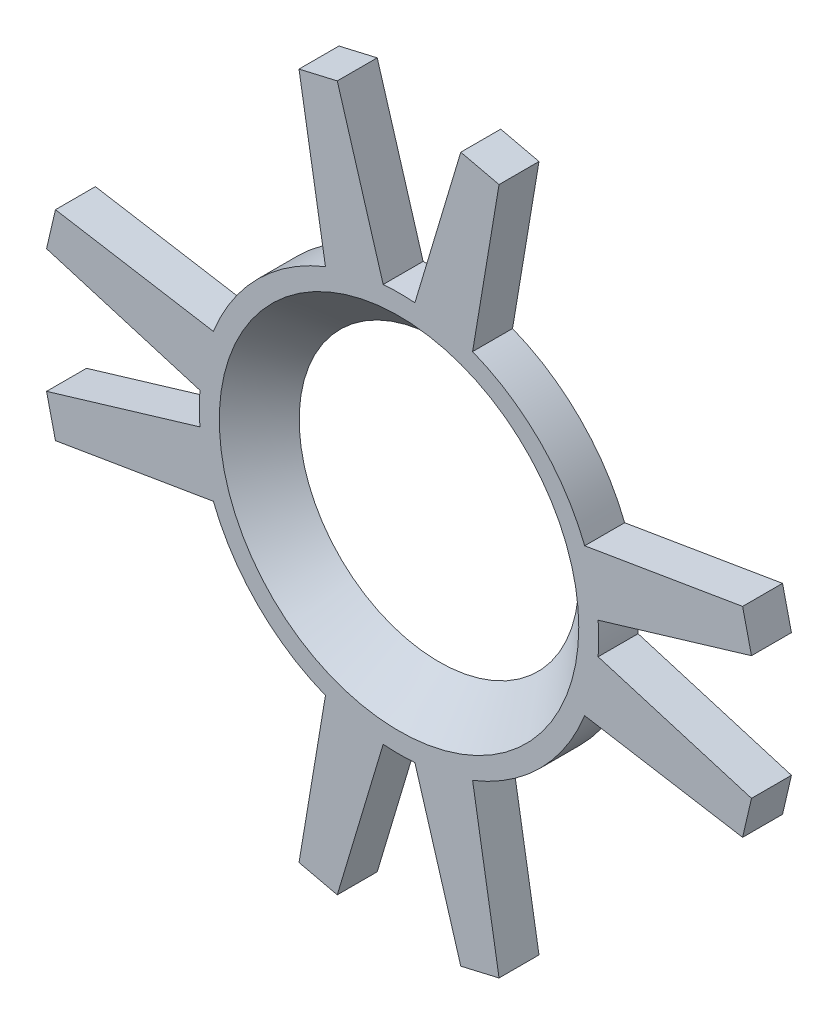
ISO-10303-21;
HEADER;
FILE_DESCRIPTION(('STEP AP214'),'2;1');
FILE_NAME('part.step','',(''),(''),'','','');
FILE_SCHEMA(('AUTOMOTIVE_DESIGN { 1 0 10303 214 1 1 1 1 }'));
ENDSEC;
DATA;
#1=APPLICATION_CONTEXT('core data for automotive mechanical design processes');
#2=APPLICATION_PROTOCOL_DEFINITION('international standard','automotive_design',2000,#1);
#3=PRODUCT_CONTEXT('',#1,'mechanical');
#4=PRODUCT('Part','Part','',(#3));
#5=PRODUCT_RELATED_PRODUCT_CATEGORY('part','',(#4));
#6=PRODUCT_DEFINITION_FORMATION('','',#4);
#7=PRODUCT_DEFINITION_CONTEXT('part definition',#1,'design');
#8=PRODUCT_DEFINITION('design','',#6,#7);
#9=PRODUCT_DEFINITION_SHAPE('','',#8);
#10=(LENGTH_UNIT() NAMED_UNIT(*) SI_UNIT(.MILLI.,.METRE.));
#11=(NAMED_UNIT(*) PLANE_ANGLE_UNIT() SI_UNIT($,.RADIAN.));
#12=(NAMED_UNIT(*) SI_UNIT($,.STERADIAN.) SOLID_ANGLE_UNIT());
#13=UNCERTAINTY_MEASURE_WITH_UNIT(LENGTH_MEASURE(1.E-05),#10,'distance_accuracy_value','');
#14=(GEOMETRIC_REPRESENTATION_CONTEXT(3) GLOBAL_UNCERTAINTY_ASSIGNED_CONTEXT((#13)) GLOBAL_UNIT_ASSIGNED_CONTEXT((#10,
#11,#12)) REPRESENTATION_CONTEXT('',''));
#15=CARTESIAN_POINT('',(0.,0.,0.));
#16=DIRECTION('',(0.,0.,1.));
#17=DIRECTION('',(1.,0.,0.));
#18=AXIS2_PLACEMENT_3D('',#15,#16,#17);
#19=CARTESIAN_POINT('',(0.,0.,2.));
#20=DIRECTION('',(0.,0.,1.));
#21=DIRECTION('',(1.,0.,0.));
#22=AXIS2_PLACEMENT_3D('',#19,#20,#21);
#23=PLANE('',#22);
#24=CARTESIAN_POINT('',(0.,0.,2.));
#25=DIRECTION('',(0.,0.,1.));
#26=DIRECTION('',(1.,0.,0.));
#27=AXIS2_PLACEMENT_3D('',#24,#25,#26);
#28=CIRCLE('',#27,9.00000000000002);
#29=CARTESIAN_POINT('',(9.00000000000002,0.,2.));
#30=VERTEX_POINT('',#29);
#31=EDGE_CURVE('E12',#30,#30,#28,.F.);
#32=ORIENTED_EDGE('',*,*,#31,.T.);
#33=EDGE_LOOP('',(#32));
#34=FACE_BOUND('',#33,.T.);
#35=DIRECTION('',(0.974038420725054,-0.226382762045708,0.));
#36=VECTOR('',#35,1.);
#37=CARTESIAN_POINT('',(-4.04984352686298,-17.4249273992547,2.));
#38=LINE('',#37,#36);
#39=CARTESIAN_POINT('',(-5.00771732151806,-17.202301565703,2.));
#40=VERTEX_POINT('',#39);
#41=CARTESIAN_POINT('',(-3.09196973220788,-17.6475532328063,2.));
#42=VERTEX_POINT('',#41);
#43=EDGE_CURVE('E484',#40,#42,#38,.T.);
#44=ORIENTED_EDGE('',*,*,#43,.T.);
#45=DIRECTION('',(0.286700746717936,0.95802018863455,0.));
#46=VECTOR('',#45,1.);
#47=CARTESIAN_POINT('',(2.00934892200833,-0.601325361606156,2.));
#48=LINE('',#47,#46);
#49=CARTESIAN_POINT('',(-0.793888425479593,-9.96843724802872,2.));
#50=VERTEX_POINT('',#49);
#51=EDGE_CURVE('E481',#42,#50,#48,.T.);
#52=ORIENTED_EDGE('',*,*,#51,.T.);
#53=CARTESIAN_POINT('',(0.,0.,2.));
#54=DIRECTION('',(0.,0.,1.));
#55=DIRECTION('',(1.,0.,0.));
#56=AXIS2_PLACEMENT_3D('',#53,#54,#55);
#57=CIRCLE('',#56,10.);
#58=CARTESIAN_POINT('',(0.793888425479691,-9.96843724802872,2.));
#59=VERTEX_POINT('',#58);
#60=EDGE_CURVE('E408',#50,#59,#57,.T.);
#61=ORIENTED_EDGE('',*,*,#60,.T.);
#62=DIRECTION('',(-0.286700746717936,0.95802018863455,0.));
#63=VECTOR('',#62,1.);
#64=CARTESIAN_POINT('',(-2.00934892200825,-0.601325361606131,2.));
#65=LINE('',#64,#63);
#66=CARTESIAN_POINT('',(3.09196973220798,-17.6475532328063,2.));
#67=VERTEX_POINT('',#66);
#68=EDGE_CURVE('E480',#67,#59,#65,.T.);
#69=ORIENTED_EDGE('',*,*,#68,.F.);
#70=DIRECTION('',(-0.974038420725054,-0.226382762045708,0.));
#71=VECTOR('',#70,1.);
#72=CARTESIAN_POINT('',(4.04984352686299,-17.4249273992547,2.));
#73=LINE('',#72,#71);
#74=CARTESIAN_POINT('',(5.00771732151816,-17.202301565703,2.));
#75=VERTEX_POINT('',#74);
#76=EDGE_CURVE('E507',#75,#67,#73,.T.);
#77=ORIENTED_EDGE('',*,*,#76,.F.);
#78=DIRECTION('',(-0.165183052049659,0.98626292605753,0.));
#79=VECTOR('',#78,1.);
#80=CARTESIAN_POINT('',(2.06858516219274,0.346454481343553,2.));
#81=LINE('',#80,#79);
#82=CARTESIAN_POINT('',(3.6836744355151,-9.29680281887972,2.));
#83=VERTEX_POINT('',#82);
#84=EDGE_CURVE('E504',#75,#83,#81,.T.);
#85=ORIENTED_EDGE('',*,*,#84,.T.);
#86=CARTESIAN_POINT('',(9.29680281887979,-3.68367443551499,2.));
#87=VERTEX_POINT('',#86);
#88=EDGE_CURVE('E400',#83,#87,#57,.T.);
#89=ORIENTED_EDGE('',*,*,#88,.T.);
#90=DIRECTION('',(-0.98626292605753,0.165183052049659,0.));
#91=VECTOR('',#90,1.);
#92=CARTESIAN_POINT('',(-0.346454481343533,-2.06858516219263,2.));
#93=LINE('',#92,#91);
#94=CARTESIAN_POINT('',(17.2023015657031,-5.00771732151804,2.));
#95=VERTEX_POINT('',#94);
#96=EDGE_CURVE('E440',#95,#87,#93,.T.);
#97=ORIENTED_EDGE('',*,*,#96,.F.);
#98=DIRECTION('',(0.226382762045721,0.974038420725051,0.));
#99=VECTOR('',#98,1.);
#100=CARTESIAN_POINT('',(17.4249273992547,-4.04984352686323,2.));
#101=LINE('',#100,#99);
#102=CARTESIAN_POINT('',(17.6475532328065,-3.0919697322075,2.));
#103=VERTEX_POINT('',#102);
#104=EDGE_CURVE('E444',#95,#103,#101,.T.);
#105=ORIENTED_EDGE('',*,*,#104,.T.);
#106=DIRECTION('',(-0.958020188634551,0.28670074671793,0.));
#107=VECTOR('',#106,1.);
#108=CARTESIAN_POINT('',(0.601325361606236,2.00934892200864,2.));
#109=LINE('',#108,#107);
#110=CARTESIAN_POINT('',(9.9684372480289,-0.793888425479262,2.));
#111=VERTEX_POINT('',#110);
#112=EDGE_CURVE('E448',#103,#111,#109,.T.);
#113=ORIENTED_EDGE('',*,*,#112,.T.);
#114=CARTESIAN_POINT('',(9.96843724802887,0.793888425479713,2.));
#115=VERTEX_POINT('',#114);
#116=EDGE_CURVE('E402',#111,#115,#57,.T.);
#117=ORIENTED_EDGE('',*,*,#116,.T.);
#118=DIRECTION('',(-0.95802018863455,-0.286700746717936,0.));
#119=VECTOR('',#118,1.);
#120=CARTESIAN_POINT('',(0.601325361606132,-2.00934892200825,2.));
#121=LINE('',#120,#119);
#122=CARTESIAN_POINT('',(17.6475532328063,3.09196973220799,2.));
#123=VERTEX_POINT('',#122);
#124=EDGE_CURVE('E173',#123,#115,#121,.T.);
#125=ORIENTED_EDGE('',*,*,#124,.F.);
#126=DIRECTION('',(0.226382762045711,-0.974038420725053,0.));
#127=VECTOR('',#126,1.);
#128=CARTESIAN_POINT('',(17.4249273992547,4.04984352686306,2.));
#129=LINE('',#128,#127);
#130=CARTESIAN_POINT('',(17.202301565703,5.00771732151853,2.));
#131=VERTEX_POINT('',#130);
#132=EDGE_CURVE('E551',#131,#123,#129,.T.);
#133=ORIENTED_EDGE('',*,*,#132,.F.);
#134=DIRECTION('',(-0.986262926057529,-0.165183052049664,0.));
#135=VECTOR('',#134,1.);
#136=CARTESIAN_POINT('',(-0.346454481343611,2.06858516219302,2.));
#137=LINE('',#136,#135);
#138=CARTESIAN_POINT('',(9.29680281887973,3.68367443551544,2.));
#139=VERTEX_POINT('',#138);
#140=EDGE_CURVE('E547',#131,#139,#137,.T.);
#141=ORIENTED_EDGE('',*,*,#140,.T.);
#142=CARTESIAN_POINT('',(3.68367443551548,9.29680281887971,2.));
#143=VERTEX_POINT('',#142);
#144=EDGE_CURVE('E397',#139,#143,#57,.T.);
#145=ORIENTED_EDGE('',*,*,#144,.T.);
#146=DIRECTION('',(-0.165183052049668,-0.986262926057528,0.));
#147=VECTOR('',#146,1.);
#148=CARTESIAN_POINT('',(2.06858516219302,-0.346454481343619,2.));
#149=LINE('',#148,#147);
#150=CARTESIAN_POINT('',(5.0077173215186,17.202301565703,2.));
#151=VERTEX_POINT('',#150);
#152=EDGE_CURVE('E503',#151,#143,#149,.T.);
#153=ORIENTED_EDGE('',*,*,#152,.F.);
#154=DIRECTION('',(-0.974038420725053,0.226382762045709,0.));
#155=VECTOR('',#154,1.);
#156=CARTESIAN_POINT('',(4.04984352686301,17.4249273992547,2.));
#157=LINE('',#156,#155);
#158=CARTESIAN_POINT('',(3.09196973220744,17.6475532328065,2.));
#159=VERTEX_POINT('',#158);
#160=EDGE_CURVE('E527',#151,#159,#157,.T.);
#161=ORIENTED_EDGE('',*,*,#160,.T.);
#162=DIRECTION('',(-0.286700746717927,-0.958020188634552,0.));
#163=VECTOR('',#162,1.);
#164=CARTESIAN_POINT('',(-2.00934892200865,0.60132536160623,2.));
#165=LINE('',#164,#163);
#166=CARTESIAN_POINT('',(0.793888425479226,9.96843724802891,2.));
#167=VERTEX_POINT('',#166);
#168=EDGE_CURVE('E396',#159,#167,#165,.T.);
#169=ORIENTED_EDGE('',*,*,#168,.T.);
#170=CARTESIAN_POINT('',(-0.793888425479223,9.96843724802891,2.));
#171=VERTEX_POINT('',#170);
#172=EDGE_CURVE('E375',#167,#171,#57,.T.);
#173=ORIENTED_EDGE('',*,*,#172,.T.);
#174=DIRECTION('',(0.286700746717927,-0.958020188634552,0.));
#175=VECTOR('',#174,1.);
#176=CARTESIAN_POINT('',(2.00934892200865,0.601325361606232,2.));
#177=LINE('',#176,#175);
#178=CARTESIAN_POINT('',(-3.09196973220744,17.6475532328065,2.));
#179=VERTEX_POINT('',#178);
#180=EDGE_CURVE('E385',#179,#171,#177,.T.);
#181=ORIENTED_EDGE('',*,*,#180,.F.);
#182=DIRECTION('',(0.974038420725053,0.226382762045709,0.));
#183=VECTOR('',#182,1.);
#184=CARTESIAN_POINT('',(-4.04984352686302,17.4249273992547,2.));
#185=LINE('',#184,#183);
#186=CARTESIAN_POINT('',(-5.00771732151859,17.202301565703,2.));
#187=VERTEX_POINT('',#186);
#188=EDGE_CURVE('E390',#187,#179,#185,.T.);
#189=ORIENTED_EDGE('',*,*,#188,.F.);
#190=DIRECTION('',(0.165183052049721,-0.986262926057519,0.));
#191=VECTOR('',#190,1.);
#192=CARTESIAN_POINT('',(-2.06858516219206,-0.346454481343571,2.));
#193=LINE('',#192,#191);
#194=CARTESIAN_POINT('',(-3.68367443551505,9.2968028188798,2.));
#195=VERTEX_POINT('',#194);
#196=EDGE_CURVE('E611',#187,#195,#193,.T.);
#197=ORIENTED_EDGE('',*,*,#196,.T.);
#198=CARTESIAN_POINT('',(-9.29680281887968,3.68367443551557,2.));
#199=VERTEX_POINT('',#198);
#200=EDGE_CURVE('E398',#195,#199,#57,.T.);
#201=ORIENTED_EDGE('',*,*,#200,.T.);
#202=DIRECTION('',(0.98626292605754,-0.165183052049596,0.));
#203=VECTOR('',#202,1.);
#204=CARTESIAN_POINT('',(0.346454481343603,2.06858516219384,2.));
#205=LINE('',#204,#203);
#206=CARTESIAN_POINT('',(-17.2023015657031,5.00771732151812,2.));
#207=VERTEX_POINT('',#206);
#208=EDGE_CURVE('E569',#207,#199,#205,.T.);
#209=ORIENTED_EDGE('',*,*,#208,.F.);
#210=DIRECTION('',(-0.226382762045708,-0.974038420725054,0.));
#211=VECTOR('',#210,1.);
#212=CARTESIAN_POINT('',(-17.4249273992547,4.04984352686299,2.));
#213=LINE('',#212,#211);
#214=CARTESIAN_POINT('',(-17.6475532328063,3.09196973220794,2.));
#215=VERTEX_POINT('',#214);
#216=EDGE_CURVE('E595',#207,#215,#213,.T.);
#217=ORIENTED_EDGE('',*,*,#216,.T.);
#218=DIRECTION('',(0.95802018863455,-0.286700746717935,0.));
#219=VECTOR('',#218,1.);
#220=CARTESIAN_POINT('',(-0.601325361606139,-2.00934892200828,2.));
#221=LINE('',#220,#219);
#222=CARTESIAN_POINT('',(-9.96843724802874,0.793888425479659,2.));
#223=VERTEX_POINT('',#222);
#224=EDGE_CURVE('E591',#215,#223,#221,.T.);
#225=ORIENTED_EDGE('',*,*,#224,.T.);
#226=CARTESIAN_POINT('',(-9.96843724802874,-0.793888425479625,2.));
#227=VERTEX_POINT('',#226);
#228=EDGE_CURVE('E405',#223,#227,#57,.T.);
#229=ORIENTED_EDGE('',*,*,#228,.T.);
#230=DIRECTION('',(0.95802018863455,0.286700746717936,0.));
#231=VECTOR('',#230,1.);
#232=CARTESIAN_POINT('',(-0.601325361606151,2.00934892200831,2.));
#233=LINE('',#232,#231);
#234=CARTESIAN_POINT('',(-17.6475532328063,-3.09196973220791,2.));
#235=VERTEX_POINT('',#234);
#236=EDGE_CURVE('E546',#235,#227,#233,.T.);
#237=ORIENTED_EDGE('',*,*,#236,.F.);
#238=DIRECTION('',(-0.226382762045708,0.974038420725054,0.));
#239=VECTOR('',#238,1.);
#240=CARTESIAN_POINT('',(-17.4249273992547,-4.04984352686299,2.));
#241=LINE('',#240,#239);
#242=CARTESIAN_POINT('',(-17.2023015657031,-5.00771732151809,2.));
#243=VERTEX_POINT('',#242);
#244=EDGE_CURVE('E574',#243,#235,#241,.T.);
#245=ORIENTED_EDGE('',*,*,#244,.F.);
#246=DIRECTION('',(0.986262926057529,0.165183052049659,0.));
#247=VECTOR('',#246,1.);
#248=CARTESIAN_POINT('',(0.346454481343542,-2.06858516219268,2.));
#249=LINE('',#248,#247);
#250=CARTESIAN_POINT('',(-9.29680281887974,-3.68367443551504,2.));
#251=VERTEX_POINT('',#250);
#252=EDGE_CURVE('E570',#243,#251,#249,.T.);
#253=ORIENTED_EDGE('',*,*,#252,.T.);
#254=CARTESIAN_POINT('',(-3.68367443551501,-9.29680281887972,2.));
#255=VERTEX_POINT('',#254);
#256=EDGE_CURVE('E403',#251,#255,#57,.T.);
#257=ORIENTED_EDGE('',*,*,#256,.T.);
#258=DIRECTION('',(0.165183052049659,0.98626292605753,0.));
#259=VECTOR('',#258,1.);
#260=CARTESIAN_POINT('',(-2.06858516219265,0.346454481343538,2.));
#261=LINE('',#260,#259);
#262=EDGE_CURVE('E458',#40,#255,#261,.T.);
#263=ORIENTED_EDGE('',*,*,#262,.F.);
#264=EDGE_LOOP('',(#44,#52,#61,#69,#77,#85,#89,#97,#105,#113,#117,#125,#133,#141,#145,#153,#161,
#169,#173,#181,#189,#197,#201,#209,#217,#225,#229,#237,#245,#253,#257,#263));
#265=FACE_BOUND('',#264,.T.);
#266=ADVANCED_FACE('F157',(#34,#265),#23,.T.);
#267=CARTESIAN_POINT('',(0.,0.,0.));
#268=DIRECTION('',(0.,0.,1.));
#269=DIRECTION('',(1.,0.,0.));
#270=AXIS2_PLACEMENT_3D('',#267,#268,#269);
#271=PLANE('',#270);
#272=CARTESIAN_POINT('',(0.,0.,0.));
#273=DIRECTION('',(0.,0.,1.));
#274=DIRECTION('',(1.,0.,0.));
#275=AXIS2_PLACEMENT_3D('',#272,#273,#274);
#276=CIRCLE('',#275,7.);
#277=CARTESIAN_POINT('',(7.,0.,0.));
#278=VERTEX_POINT('',#277);
#279=EDGE_CURVE('E166',#278,#278,#276,.T.);
#280=ORIENTED_EDGE('',*,*,#279,.T.);
#281=EDGE_LOOP('',(#280));
#282=FACE_BOUND('',#281,.T.);
#283=DIRECTION('',(0.286700746717936,0.95802018863455,0.));
#284=VECTOR('',#283,1.);
#285=CARTESIAN_POINT('',(2.00934892200833,-0.601325361606156,0.));
#286=LINE('',#285,#284);
#287=CARTESIAN_POINT('',(-3.09196973220788,-17.6475532328063,0.));
#288=VERTEX_POINT('',#287);
#289=CARTESIAN_POINT('',(-0.793888425479606,-9.96843724802888,0.));
#290=VERTEX_POINT('',#289);
#291=EDGE_CURVE('E181',#288,#290,#286,.T.);
#292=ORIENTED_EDGE('',*,*,#291,.F.);
#293=DIRECTION('',(0.974038420725054,-0.226382762045708,0.));
#294=VECTOR('',#293,1.);
#295=CARTESIAN_POINT('',(-4.04984352686298,-17.4249273992547,0.));
#296=LINE('',#295,#294);
#297=CARTESIAN_POINT('',(-5.00771732151806,-17.202301565703,0.));
#298=VERTEX_POINT('',#297);
#299=EDGE_CURVE('E489',#298,#288,#296,.T.);
#300=ORIENTED_EDGE('',*,*,#299,.F.);
#301=DIRECTION('',(0.165183052049659,0.98626292605753,0.));
#302=VECTOR('',#301,1.);
#303=CARTESIAN_POINT('',(-2.06858516219265,0.346454481343538,0.));
#304=LINE('',#303,#302);
#305=CARTESIAN_POINT('',(-3.68367443551507,-9.29680281887987,0.));
#306=VERTEX_POINT('',#305);
#307=EDGE_CURVE('E483',#298,#306,#304,.T.);
#308=ORIENTED_EDGE('',*,*,#307,.T.);
#309=CARTESIAN_POINT('',(0.,0.,0.));
#310=DIRECTION('',(0.,0.,1.));
#311=DIRECTION('',(1.,0.,0.));
#312=AXIS2_PLACEMENT_3D('',#309,#310,#311);
#313=CIRCLE('',#312,10.);
#314=CARTESIAN_POINT('',(-9.29680281887974,-3.68367443551504,0.));
#315=VERTEX_POINT('',#314);
#316=EDGE_CURVE('E427',#315,#306,#313,.T.);
#317=ORIENTED_EDGE('',*,*,#316,.F.);
#318=DIRECTION('',(0.986262926057529,0.165183052049659,0.));
#319=VECTOR('',#318,1.);
#320=CARTESIAN_POINT('',(0.346454481343542,-2.06858516219268,0.));
#321=LINE('',#320,#319);
#322=CARTESIAN_POINT('',(-17.2023015657031,-5.00771732151809,0.));
#323=VERTEX_POINT('',#322);
#324=EDGE_CURVE('E562',#323,#315,#321,.T.);
#325=ORIENTED_EDGE('',*,*,#324,.F.);
#326=DIRECTION('',(-0.226382762045708,0.974038420725054,0.));
#327=VECTOR('',#326,1.);
#328=CARTESIAN_POINT('',(-17.4249273992547,-4.04984352686299,0.));
#329=LINE('',#328,#327);
#330=CARTESIAN_POINT('',(-17.6475532328063,-3.09196973220791,0.));
#331=VERTEX_POINT('',#330);
#332=EDGE_CURVE('E580',#323,#331,#329,.T.);
#333=ORIENTED_EDGE('',*,*,#332,.T.);
#334=DIRECTION('',(0.95802018863455,0.286700746717936,0.));
#335=VECTOR('',#334,1.);
#336=CARTESIAN_POINT('',(-0.601325361606151,2.00934892200831,0.));
#337=LINE('',#336,#335);
#338=CARTESIAN_POINT('',(-9.96843724802887,-0.793888425479636,0.));
#339=VERTEX_POINT('',#338);
#340=EDGE_CURVE('E573',#331,#339,#337,.T.);
#341=ORIENTED_EDGE('',*,*,#340,.T.);
#342=CARTESIAN_POINT('',(-9.96843724802874,0.793888425479658,0.));
#343=VERTEX_POINT('',#342);
#344=EDGE_CURVE('E434',#343,#339,#313,.T.);
#345=ORIENTED_EDGE('',*,*,#344,.F.);
#346=DIRECTION('',(0.95802018863455,-0.286700746717935,0.));
#347=VECTOR('',#346,1.);
#348=CARTESIAN_POINT('',(-0.601325361606139,-2.00934892200828,0.));
#349=LINE('',#348,#347);
#350=CARTESIAN_POINT('',(-17.6475532328063,3.09196973220794,0.));
#351=VERTEX_POINT('',#350);
#352=EDGE_CURVE('E586',#351,#343,#349,.T.);
#353=ORIENTED_EDGE('',*,*,#352,.F.);
#354=DIRECTION('',(-0.226382762045708,-0.974038420725054,0.));
#355=VECTOR('',#354,1.);
#356=CARTESIAN_POINT('',(-17.4249273992547,4.04984352686299,0.));
#357=LINE('',#356,#355);
#358=CARTESIAN_POINT('',(-17.2023015657031,5.00771732151812,0.));
#359=VERTEX_POINT('',#358);
#360=EDGE_CURVE('E602',#359,#351,#357,.T.);
#361=ORIENTED_EDGE('',*,*,#360,.F.);
#362=DIRECTION('',(0.98626292605754,-0.165183052049596,0.));
#363=VECTOR('',#362,1.);
#364=CARTESIAN_POINT('',(0.346454481343603,2.06858516219384,0.));
#365=LINE('',#364,#363);
#366=CARTESIAN_POINT('',(-9.29680281887967,3.68367443551557,0.));
#367=VERTEX_POINT('',#366);
#368=EDGE_CURVE('E594',#359,#367,#365,.T.);
#369=ORIENTED_EDGE('',*,*,#368,.T.);
#370=CARTESIAN_POINT('',(-3.68367443551505,9.2968028188798,0.));
#371=VERTEX_POINT('',#370);
#372=EDGE_CURVE('E431',#371,#367,#313,.T.);
#373=ORIENTED_EDGE('',*,*,#372,.F.);
#374=DIRECTION('',(0.165183052049721,-0.986262926057519,0.));
#375=VECTOR('',#374,1.);
#376=CARTESIAN_POINT('',(-2.06858516219206,-0.346454481343571,0.));
#377=LINE('',#376,#375);
#378=CARTESIAN_POINT('',(-5.00771732151859,17.202301565703,0.));
#379=VERTEX_POINT('',#378);
#380=EDGE_CURVE('E381',#379,#371,#377,.T.);
#381=ORIENTED_EDGE('',*,*,#380,.F.);
#382=DIRECTION('',(0.974038420725053,0.226382762045709,0.));
#383=VECTOR('',#382,1.);
#384=CARTESIAN_POINT('',(-4.04984352686302,17.4249273992547,0.));
#385=LINE('',#384,#383);
#386=CARTESIAN_POINT('',(-3.09196973220744,17.6475532328065,0.));
#387=VERTEX_POINT('',#386);
#388=EDGE_CURVE('E618',#379,#387,#385,.T.);
#389=ORIENTED_EDGE('',*,*,#388,.T.);
#390=DIRECTION('',(0.286700746717927,-0.958020188634552,0.));
#391=VECTOR('',#390,1.);
#392=CARTESIAN_POINT('',(2.00934892200865,0.601325361606232,0.));
#393=LINE('',#392,#391);
#394=CARTESIAN_POINT('',(-0.793888425479223,9.96843724802891,0.));
#395=VERTEX_POINT('',#394);
#396=EDGE_CURVE('E614',#387,#395,#393,.T.);
#397=ORIENTED_EDGE('',*,*,#396,.T.);
#398=CARTESIAN_POINT('',(0.793888425479226,9.96843724802891,0.));
#399=VERTEX_POINT('',#398);
#400=EDGE_CURVE('E377',#399,#395,#313,.T.);
#401=ORIENTED_EDGE('',*,*,#400,.F.);
#402=DIRECTION('',(-0.286700746717927,-0.958020188634552,0.));
#403=VECTOR('',#402,1.);
#404=CARTESIAN_POINT('',(-2.00934892200865,0.60132536160623,0.));
#405=LINE('',#404,#403);
#406=CARTESIAN_POINT('',(3.09196973220744,17.6475532328065,0.));
#407=VERTEX_POINT('',#406);
#408=EDGE_CURVE('E519',#407,#399,#405,.T.);
#409=ORIENTED_EDGE('',*,*,#408,.F.);
#410=DIRECTION('',(-0.974038420725053,0.226382762045709,0.));
#411=VECTOR('',#410,1.);
#412=CARTESIAN_POINT('',(4.04984352686301,17.4249273992547,0.));
#413=LINE('',#412,#411);
#414=CARTESIAN_POINT('',(5.0077173215186,17.202301565703,0.));
#415=VERTEX_POINT('',#414);
#416=EDGE_CURVE('E533',#415,#407,#413,.T.);
#417=ORIENTED_EDGE('',*,*,#416,.F.);
#418=DIRECTION('',(-0.165183052049668,-0.986262926057528,0.));
#419=VECTOR('',#418,1.);
#420=CARTESIAN_POINT('',(2.06858516219302,-0.346454481343619,0.));
#421=LINE('',#420,#419);
#422=CARTESIAN_POINT('',(3.68367443551548,9.29680281887971,0.));
#423=VERTEX_POINT('',#422);
#424=EDGE_CURVE('E526',#415,#423,#421,.T.);
#425=ORIENTED_EDGE('',*,*,#424,.T.);
#426=CARTESIAN_POINT('',(9.29680281887973,3.68367443551544,0.));
#427=VERTEX_POINT('',#426);
#428=EDGE_CURVE('E430',#427,#423,#313,.T.);
#429=ORIENTED_EDGE('',*,*,#428,.F.);
#430=DIRECTION('',(-0.986262926057529,-0.165183052049664,0.));
#431=VECTOR('',#430,1.);
#432=CARTESIAN_POINT('',(-0.346454481343611,2.06858516219302,0.));
#433=LINE('',#432,#431);
#434=CARTESIAN_POINT('',(17.202301565703,5.00771732151853,0.));
#435=VERTEX_POINT('',#434);
#436=EDGE_CURVE('E540',#435,#427,#433,.T.);
#437=ORIENTED_EDGE('',*,*,#436,.F.);
#438=DIRECTION('',(0.226382762045711,-0.974038420725053,0.));
#439=VECTOR('',#438,1.);
#440=CARTESIAN_POINT('',(17.4249273992547,4.04984352686306,0.));
#441=LINE('',#440,#439);
#442=CARTESIAN_POINT('',(17.6475532328064,3.09196973220799,0.));
#443=VERTEX_POINT('',#442);
#444=EDGE_CURVE('E556',#435,#443,#441,.T.);
#445=ORIENTED_EDGE('',*,*,#444,.T.);
#446=DIRECTION('',(-0.95802018863455,-0.286700746717936,0.));
#447=VECTOR('',#446,1.);
#448=CARTESIAN_POINT('',(0.601325361606132,-2.00934892200825,0.));
#449=LINE('',#448,#447);
#450=CARTESIAN_POINT('',(9.96843724802879,0.793888425479707,0.));
#451=VERTEX_POINT('',#450);
#452=EDGE_CURVE('E550',#443,#451,#449,.T.);
#453=ORIENTED_EDGE('',*,*,#452,.T.);
#454=CARTESIAN_POINT('',(9.9684372480289,-0.793888425479262,0.));
#455=VERTEX_POINT('',#454);
#456=EDGE_CURVE('E428',#455,#451,#313,.T.);
#457=ORIENTED_EDGE('',*,*,#456,.F.);
#458=DIRECTION('',(-0.958020188634551,0.28670074671793,0.));
#459=VECTOR('',#458,1.);
#460=CARTESIAN_POINT('',(0.601325361606236,2.00934892200864,0.));
#461=LINE('',#460,#459);
#462=CARTESIAN_POINT('',(17.6475532328065,-3.0919697322075,0.));
#463=VERTEX_POINT('',#462);
#464=EDGE_CURVE('E451',#463,#455,#461,.T.);
#465=ORIENTED_EDGE('',*,*,#464,.F.);
#466=DIRECTION('',(0.226382762045721,0.974038420725051,0.));
#467=VECTOR('',#466,1.);
#468=CARTESIAN_POINT('',(17.4249273992547,-4.04984352686323,0.));
#469=LINE('',#468,#467);
#470=CARTESIAN_POINT('',(17.2023015657031,-5.00771732151804,0.));
#471=VERTEX_POINT('',#470);
#472=EDGE_CURVE('E464',#471,#463,#469,.T.);
#473=ORIENTED_EDGE('',*,*,#472,.F.);
#474=DIRECTION('',(-0.98626292605753,0.165183052049659,0.));
#475=VECTOR('',#474,1.);
#476=CARTESIAN_POINT('',(-0.346454481343533,-2.06858516219263,0.));
#477=LINE('',#476,#475);
#478=CARTESIAN_POINT('',(9.29680281887979,-3.68367443551499,0.));
#479=VERTEX_POINT('',#478);
#480=EDGE_CURVE('E455',#471,#479,#477,.T.);
#481=ORIENTED_EDGE('',*,*,#480,.T.);
#482=CARTESIAN_POINT('',(3.68367443551515,-9.29680281887984,0.));
#483=VERTEX_POINT('',#482);
#484=EDGE_CURVE('E418',#483,#479,#313,.T.);
#485=ORIENTED_EDGE('',*,*,#484,.F.);
#486=DIRECTION('',(-0.165183052049659,0.98626292605753,0.));
#487=VECTOR('',#486,1.);
#488=CARTESIAN_POINT('',(2.06858516219274,0.346454481343553,0.));
#489=LINE('',#488,#487);
#490=CARTESIAN_POINT('',(5.00771732151816,-17.202301565703,0.));
#491=VERTEX_POINT('',#490);
#492=EDGE_CURVE('E496',#491,#483,#489,.T.);
#493=ORIENTED_EDGE('',*,*,#492,.F.);
#494=DIRECTION('',(-0.974038420725054,-0.226382762045708,0.));
#495=VECTOR('',#494,1.);
#496=CARTESIAN_POINT('',(4.04984352686299,-17.4249273992547,0.));
#497=LINE('',#496,#495);
#498=CARTESIAN_POINT('',(3.09196973220798,-17.6475532328063,0.));
#499=VERTEX_POINT('',#498);
#500=EDGE_CURVE('E513',#491,#499,#497,.T.);
#501=ORIENTED_EDGE('',*,*,#500,.T.);
#502=DIRECTION('',(-0.286700746717936,0.95802018863455,0.));
#503=VECTOR('',#502,1.);
#504=CARTESIAN_POINT('',(-2.00934892200825,-0.601325361606131,0.));
#505=LINE('',#504,#503);
#506=CARTESIAN_POINT('',(0.793888425479691,-9.96843724802872,0.));
#507=VERTEX_POINT('',#506);
#508=EDGE_CURVE('E506',#499,#507,#505,.T.);
#509=ORIENTED_EDGE('',*,*,#508,.T.);
#510=EDGE_CURVE('E422',#290,#507,#313,.T.);
#511=ORIENTED_EDGE('',*,*,#510,.F.);
#512=EDGE_LOOP('',(#292,#300,#308,#317,#325,#333,#341,#345,#353,#361,#369,#373,#381,#389,#397,
#401,#409,#417,#425,#429,#437,#445,#453,#457,#465,#473,#481,#485,#493,#501,#509,#511));
#513=FACE_BOUND('',#512,.T.);
#514=ADVANCED_FACE('F620',(#282,#513),#271,.F.);
#515=CARTESIAN_POINT('',(-2.06858516219206,-0.346454481343571,0.));
#516=DIRECTION('',(-0.986262926057519,-0.165183052049721,0.));
#517=DIRECTION('',(0.165183052049721,-0.986262926057519,0.));
#518=AXIS2_PLACEMENT_3D('',#515,#516,#517);
#519=PLANE('',#518);
#520=ORIENTED_EDGE('',*,*,#196,.F.);
#521=DIRECTION('',(0.,0.,1.));
#522=VECTOR('',#521,1.);
#523=CARTESIAN_POINT('',(-5.00771732151859,17.202301565703,0.));
#524=LINE('',#523,#522);
#525=EDGE_CURVE('E607',#379,#187,#524,.T.);
#526=ORIENTED_EDGE('',*,*,#525,.F.);
#527=ORIENTED_EDGE('',*,*,#380,.T.);
#528=DIRECTION('',(0.,0.,1.));
#529=VECTOR('',#528,1.);
#530=CARTESIAN_POINT('',(-3.68367443551505,9.2968028188798,0.));
#531=LINE('',#530,#529);
#532=EDGE_CURVE('E609',#371,#195,#531,.T.);
#533=ORIENTED_EDGE('',*,*,#532,.T.);
#534=EDGE_LOOP('',(#520,#526,#527,#533));
#535=FACE_BOUND('',#534,.T.);
#536=ADVANCED_FACE('F629',(#535),#519,.T.);
#537=CARTESIAN_POINT('',(-4.04984352686302,17.4249273992547,0.));
#538=DIRECTION('',(0.226382762045709,-0.974038420725053,0.));
#539=DIRECTION('',(0.974038420725053,0.226382762045709,0.));
#540=AXIS2_PLACEMENT_3D('',#537,#538,#539);
#541=PLANE('',#540);
#542=ORIENTED_EDGE('',*,*,#188,.T.);
#543=DIRECTION('',(0.,0.,1.));
#544=VECTOR('',#543,1.);
#545=CARTESIAN_POINT('',(-3.09196973220744,17.6475532328065,0.));
#546=LINE('',#545,#544);
#547=EDGE_CURVE('E380',#387,#179,#546,.T.);
#548=ORIENTED_EDGE('',*,*,#547,.F.);
#549=ORIENTED_EDGE('',*,*,#388,.F.);
#550=ORIENTED_EDGE('',*,*,#525,.T.);
#551=EDGE_LOOP('',(#542,#548,#549,#550));
#552=FACE_BOUND('',#551,.T.);
#553=ADVANCED_FACE('F624',(#552),#541,.F.);
#554=CARTESIAN_POINT('',(2.00934892200865,0.601325361606232,0.));
#555=DIRECTION('',(-0.958020188634552,-0.286700746717927,0.));
#556=DIRECTION('',(0.286700746717927,-0.958020188634552,0.));
#557=AXIS2_PLACEMENT_3D('',#554,#555,#556);
#558=PLANE('',#557);
#559=ORIENTED_EDGE('',*,*,#180,.T.);
#560=DIRECTION('',(0.,0.,1.));
#561=VECTOR('',#560,1.);
#562=CARTESIAN_POINT('',(-0.793888425479223,9.96843724802891,0.));
#563=LINE('',#562,#561);
#564=EDGE_CURVE('E370',#395,#171,#563,.T.);
#565=ORIENTED_EDGE('',*,*,#564,.F.);
#566=ORIENTED_EDGE('',*,*,#396,.F.);
#567=ORIENTED_EDGE('',*,*,#547,.T.);
#568=EDGE_LOOP('',(#559,#565,#566,#567));
#569=FACE_BOUND('',#568,.T.);
#570=ADVANCED_FACE('F386',(#569),#558,.F.);
#571=CARTESIAN_POINT('',(2.06858516219274,0.346454481343553,0.));
#572=DIRECTION('',(0.986262926057529,0.165183052049659,0.));
#573=DIRECTION('',(-0.165183052049659,0.986262926057529,0.));
#574=AXIS2_PLACEMENT_3D('',#571,#572,#573);
#575=PLANE('',#574);
#576=ORIENTED_EDGE('',*,*,#84,.F.);
#577=DIRECTION('',(0.,0.,1.));
#578=VECTOR('',#577,1.);
#579=CARTESIAN_POINT('',(5.00771732151816,-17.202301565703,0.));
#580=LINE('',#579,#578);
#581=EDGE_CURVE('E499',#491,#75,#580,.T.);
#582=ORIENTED_EDGE('',*,*,#581,.F.);
#583=ORIENTED_EDGE('',*,*,#492,.T.);
#584=DIRECTION('',(0.,0.,1.));
#585=VECTOR('',#584,1.);
#586=CARTESIAN_POINT('',(3.6836744355151,-9.29680281887972,0.));
#587=LINE('',#586,#585);
#588=EDGE_CURVE('E501',#483,#83,#587,.T.);
#589=ORIENTED_EDGE('',*,*,#588,.T.);
#590=EDGE_LOOP('',(#576,#582,#583,#589));
#591=FACE_BOUND('',#590,.T.);
#592=ADVANCED_FACE('F693',(#591),#575,.T.);
#593=CARTESIAN_POINT('',(4.04984352686299,-17.4249273992547,0.));
#594=DIRECTION('',(-0.226382762045708,0.974038420725054,0.));
#595=DIRECTION('',(-0.974038420725054,-0.226382762045708,0.));
#596=AXIS2_PLACEMENT_3D('',#593,#594,#595);
#597=PLANE('',#596);
#598=ORIENTED_EDGE('',*,*,#76,.T.);
#599=DIRECTION('',(0.,0.,1.));
#600=VECTOR('',#599,1.);
#601=CARTESIAN_POINT('',(3.09196973220798,-17.6475532328063,0.));
#602=LINE('',#601,#600);
#603=EDGE_CURVE('E495',#499,#67,#602,.T.);
#604=ORIENTED_EDGE('',*,*,#603,.F.);
#605=ORIENTED_EDGE('',*,*,#500,.F.);
#606=ORIENTED_EDGE('',*,*,#581,.T.);
#607=EDGE_LOOP('',(#598,#604,#605,#606));
#608=FACE_BOUND('',#607,.T.);
#609=ADVANCED_FACE('F689',(#608),#597,.F.);
#610=CARTESIAN_POINT('',(-2.00934892200825,-0.601325361606131,0.));
#611=DIRECTION('',(0.95802018863455,0.286700746717936,0.));
#612=DIRECTION('',(-0.286700746717936,0.95802018863455,0.));
#613=AXIS2_PLACEMENT_3D('',#610,#611,#612);
#614=PLANE('',#613);
#615=ORIENTED_EDGE('',*,*,#68,.T.);
#616=DIRECTION('',(0.,0.,1.));
#617=VECTOR('',#616,1.);
#618=CARTESIAN_POINT('',(0.793888425479691,-9.96843724802872,0.));
#619=LINE('',#618,#617);
#620=EDGE_CURVE('E493',#507,#59,#619,.T.);
#621=ORIENTED_EDGE('',*,*,#620,.F.);
#622=ORIENTED_EDGE('',*,*,#508,.F.);
#623=ORIENTED_EDGE('',*,*,#603,.T.);
#624=EDGE_LOOP('',(#615,#621,#622,#623));
#625=FACE_BOUND('',#624,.T.);
#626=ADVANCED_FACE('F684',(#625),#614,.F.);
#627=CARTESIAN_POINT('',(2.00934892200833,-0.601325361606156,0.));
#628=DIRECTION('',(0.95802018863455,-0.286700746717936,0.));
#629=DIRECTION('',(0.286700746717936,0.95802018863455,0.));
#630=AXIS2_PLACEMENT_3D('',#627,#628,#629);
#631=PLANE('',#630);
#632=ORIENTED_EDGE('',*,*,#51,.F.);
#633=DIRECTION('',(0.,0.,1.));
#634=VECTOR('',#633,1.);
#635=CARTESIAN_POINT('',(-3.09196973220788,-17.6475532328063,0.));
#636=LINE('',#635,#634);
#637=EDGE_CURVE('E476',#288,#42,#636,.T.);
#638=ORIENTED_EDGE('',*,*,#637,.F.);
#639=ORIENTED_EDGE('',*,*,#291,.T.);
#640=DIRECTION('',(0.,0.,1.));
#641=VECTOR('',#640,1.);
#642=CARTESIAN_POINT('',(-0.793888425479593,-9.96843724802872,0.));
#643=LINE('',#642,#641);
#644=EDGE_CURVE('E478',#290,#50,#643,.T.);
#645=ORIENTED_EDGE('',*,*,#644,.T.);
#646=EDGE_LOOP('',(#632,#638,#639,#645));
#647=FACE_BOUND('',#646,.T.);
#648=ADVANCED_FACE('F677',(#647),#631,.T.);
#649=CARTESIAN_POINT('',(-4.04984352686298,-17.4249273992547,0.));
#650=DIRECTION('',(-0.226382762045708,-0.974038420725054,0.));
#651=DIRECTION('',(0.974038420725054,-0.226382762045708,0.));
#652=AXIS2_PLACEMENT_3D('',#649,#650,#651);
#653=PLANE('',#652);
#654=ORIENTED_EDGE('',*,*,#43,.F.);
#655=DIRECTION('',(0.,0.,1.));
#656=VECTOR('',#655,1.);
#657=CARTESIAN_POINT('',(-5.00771732151806,-17.202301565703,0.));
#658=LINE('',#657,#656);
#659=EDGE_CURVE('E474',#298,#40,#658,.T.);
#660=ORIENTED_EDGE('',*,*,#659,.F.);
#661=ORIENTED_EDGE('',*,*,#299,.T.);
#662=ORIENTED_EDGE('',*,*,#637,.T.);
#663=EDGE_LOOP('',(#654,#660,#661,#662));
#664=FACE_BOUND('',#663,.T.);
#665=ADVANCED_FACE('F674',(#664),#653,.T.);
#666=CARTESIAN_POINT('',(-2.06858516219265,0.346454481343538,0.));
#667=DIRECTION('',(0.986262926057529,-0.165183052049659,0.));
#668=DIRECTION('',(0.165183052049659,0.986262926057529,0.));
#669=AXIS2_PLACEMENT_3D('',#666,#667,#668);
#670=PLANE('',#669);
#671=ORIENTED_EDGE('',*,*,#262,.T.);
#672=DIRECTION('',(0.,0.,1.));
#673=VECTOR('',#672,1.);
#674=CARTESIAN_POINT('',(-3.68367443551501,-9.29680281887972,0.));
#675=LINE('',#674,#673);
#676=EDGE_CURVE('E472',#306,#255,#675,.T.);
#677=ORIENTED_EDGE('',*,*,#676,.F.);
#678=ORIENTED_EDGE('',*,*,#307,.F.);
#679=ORIENTED_EDGE('',*,*,#659,.T.);
#680=EDGE_LOOP('',(#671,#677,#678,#679));
#681=FACE_BOUND('',#680,.T.);
#682=ADVANCED_FACE('F670',(#681),#670,.F.);
#683=CARTESIAN_POINT('',(0.346454481343542,-2.06858516219268,0.));
#684=DIRECTION('',(0.165183052049659,-0.986262926057529,0.));
#685=DIRECTION('',(0.986262926057529,0.165183052049659,0.));
#686=AXIS2_PLACEMENT_3D('',#683,#684,#685);
#687=PLANE('',#686);
#688=ORIENTED_EDGE('',*,*,#252,.F.);
#689=DIRECTION('',(0.,0.,1.));
#690=VECTOR('',#689,1.);
#691=CARTESIAN_POINT('',(-17.2023015657031,-5.00771732151809,0.));
#692=LINE('',#691,#690);
#693=EDGE_CURVE('E565',#323,#243,#692,.T.);
#694=ORIENTED_EDGE('',*,*,#693,.F.);
#695=ORIENTED_EDGE('',*,*,#324,.T.);
#696=DIRECTION('',(0.,0.,1.));
#697=VECTOR('',#696,1.);
#698=CARTESIAN_POINT('',(-9.29680281887974,-3.68367443551504,0.));
#699=LINE('',#698,#697);
#700=EDGE_CURVE('E567',#315,#251,#699,.T.);
#701=ORIENTED_EDGE('',*,*,#700,.T.);
#702=EDGE_LOOP('',(#688,#694,#695,#701));
#703=FACE_BOUND('',#702,.T.);
#704=ADVANCED_FACE('F660',(#703),#687,.T.);
#705=CARTESIAN_POINT('',(-17.4249273992547,-4.04984352686299,0.));
#706=DIRECTION('',(0.974038420725054,0.226382762045708,0.));
#707=DIRECTION('',(-0.226382762045708,0.974038420725054,0.));
#708=AXIS2_PLACEMENT_3D('',#705,#706,#707);
#709=PLANE('',#708);
#710=ORIENTED_EDGE('',*,*,#244,.T.);
#711=DIRECTION('',(0.,0.,1.));
#712=VECTOR('',#711,1.);
#713=CARTESIAN_POINT('',(-17.6475532328063,-3.09196973220791,0.));
#714=LINE('',#713,#712);
#715=EDGE_CURVE('E561',#331,#235,#714,.T.);
#716=ORIENTED_EDGE('',*,*,#715,.F.);
#717=ORIENTED_EDGE('',*,*,#332,.F.);
#718=ORIENTED_EDGE('',*,*,#693,.T.);
#719=EDGE_LOOP('',(#710,#716,#717,#718));
#720=FACE_BOUND('',#719,.T.);
#721=ADVANCED_FACE('F656',(#720),#709,.F.);
#722=CARTESIAN_POINT('',(-0.601325361606151,2.00934892200831,0.));
#723=DIRECTION('',(0.286700746717936,-0.95802018863455,0.));
#724=DIRECTION('',(0.95802018863455,0.286700746717936,0.));
#725=AXIS2_PLACEMENT_3D('',#722,#723,#724);
#726=PLANE('',#725);
#727=ORIENTED_EDGE('',*,*,#236,.T.);
#728=DIRECTION('',(0.,0.,1.));
#729=VECTOR('',#728,1.);
#730=CARTESIAN_POINT('',(-9.96843724802874,-0.793888425479625,0.));
#731=LINE('',#730,#729);
#732=EDGE_CURVE('E559',#339,#227,#731,.T.);
#733=ORIENTED_EDGE('',*,*,#732,.F.);
#734=ORIENTED_EDGE('',*,*,#340,.F.);
#735=ORIENTED_EDGE('',*,*,#715,.T.);
#736=EDGE_LOOP('',(#727,#733,#734,#735));
#737=FACE_BOUND('',#736,.T.);
#738=ADVANCED_FACE('F651',(#737),#726,.F.);
#739=CARTESIAN_POINT('',(-0.601325361606139,-2.00934892200828,0.));
#740=DIRECTION('',(-0.286700746717935,-0.95802018863455,0.));
#741=DIRECTION('',(0.95802018863455,-0.286700746717935,0.));
#742=AXIS2_PLACEMENT_3D('',#739,#740,#741);
#743=PLANE('',#742);
#744=ORIENTED_EDGE('',*,*,#224,.F.);
#745=DIRECTION('',(0.,0.,1.));
#746=VECTOR('',#745,1.);
#747=CARTESIAN_POINT('',(-17.6475532328063,3.09196973220794,0.));
#748=LINE('',#747,#746);
#749=EDGE_CURVE('E588',#351,#215,#748,.T.);
#750=ORIENTED_EDGE('',*,*,#749,.F.);
#751=ORIENTED_EDGE('',*,*,#352,.T.);
#752=DIRECTION('',(0.,0.,1.));
#753=VECTOR('',#752,1.);
#754=CARTESIAN_POINT('',(-9.96843724802874,0.793888425479659,0.));
#755=LINE('',#754,#753);
#756=EDGE_CURVE('E391',#343,#223,#755,.T.);
#757=ORIENTED_EDGE('',*,*,#756,.T.);
#758=EDGE_LOOP('',(#744,#750,#751,#757));
#759=FACE_BOUND('',#758,.T.);
#760=ADVANCED_FACE('F642',(#759),#743,.T.);
#761=CARTESIAN_POINT('',(-17.4249273992547,4.04984352686299,0.));
#762=DIRECTION('',(-0.974038420725054,0.226382762045708,0.));
#763=DIRECTION('',(-0.226382762045708,-0.974038420725054,0.));
#764=AXIS2_PLACEMENT_3D('',#761,#762,#763);
#765=PLANE('',#764);
#766=ORIENTED_EDGE('',*,*,#216,.F.);
#767=DIRECTION('',(0.,0.,1.));
#768=VECTOR('',#767,1.);
#769=CARTESIAN_POINT('',(-17.2023015657031,5.00771732151812,0.));
#770=LINE('',#769,#768);
#771=EDGE_CURVE('E585',#359,#207,#770,.T.);
#772=ORIENTED_EDGE('',*,*,#771,.F.);
#773=ORIENTED_EDGE('',*,*,#360,.T.);
#774=ORIENTED_EDGE('',*,*,#749,.T.);
#775=EDGE_LOOP('',(#766,#772,#773,#774));
#776=FACE_BOUND('',#775,.T.);
#777=ADVANCED_FACE('F639',(#776),#765,.T.);
#778=CARTESIAN_POINT('',(4.04984352686301,17.4249273992547,0.));
#779=DIRECTION('',(0.226382762045709,0.974038420725053,0.));
#780=DIRECTION('',(-0.974038420725053,0.226382762045709,0.));
#781=AXIS2_PLACEMENT_3D('',#778,#779,#780);
#782=PLANE('',#781);
#783=ORIENTED_EDGE('',*,*,#160,.F.);
#784=DIRECTION('',(0.,0.,1.));
#785=VECTOR('',#784,1.);
#786=CARTESIAN_POINT('',(5.0077173215186,17.202301565703,0.));
#787=LINE('',#786,#785);
#788=EDGE_CURVE('E518',#415,#151,#787,.T.);
#789=ORIENTED_EDGE('',*,*,#788,.F.);
#790=ORIENTED_EDGE('',*,*,#416,.T.);
#791=DIRECTION('',(0.,0.,1.));
#792=VECTOR('',#791,1.);
#793=CARTESIAN_POINT('',(3.09196973220744,17.6475532328065,0.));
#794=LINE('',#793,#792);
#795=EDGE_CURVE('E521',#407,#159,#794,.T.);
#796=ORIENTED_EDGE('',*,*,#795,.T.);
#797=EDGE_LOOP('',(#783,#789,#790,#796));
#798=FACE_BOUND('',#797,.T.);
#799=ADVANCED_FACE('F706',(#798),#782,.T.);
#800=CARTESIAN_POINT('',(2.06858516219302,-0.346454481343619,0.));
#801=DIRECTION('',(-0.986262926057528,0.165183052049668,0.));
#802=DIRECTION('',(-0.165183052049668,-0.986262926057528,0.));
#803=AXIS2_PLACEMENT_3D('',#800,#801,#802);
#804=PLANE('',#803);
#805=ORIENTED_EDGE('',*,*,#152,.T.);
#806=DIRECTION('',(0.,0.,1.));
#807=VECTOR('',#806,1.);
#808=CARTESIAN_POINT('',(3.68367443551548,9.29680281887971,0.));
#809=LINE('',#808,#807);
#810=EDGE_CURVE('E516',#423,#143,#809,.T.);
#811=ORIENTED_EDGE('',*,*,#810,.F.);
#812=ORIENTED_EDGE('',*,*,#424,.F.);
#813=ORIENTED_EDGE('',*,*,#788,.T.);
#814=EDGE_LOOP('',(#805,#811,#812,#813));
#815=FACE_BOUND('',#814,.T.);
#816=ADVANCED_FACE('F758',(#815),#804,.F.);
#817=CARTESIAN_POINT('',(-0.346454481343611,2.06858516219302,0.));
#818=DIRECTION('',(-0.165183052049664,0.986262926057529,0.));
#819=DIRECTION('',(-0.986262926057529,-0.165183052049664,0.));
#820=AXIS2_PLACEMENT_3D('',#817,#818,#819);
#821=PLANE('',#820);
#822=ORIENTED_EDGE('',*,*,#140,.F.);
#823=DIRECTION('',(0.,0.,1.));
#824=VECTOR('',#823,1.);
#825=CARTESIAN_POINT('',(17.202301565703,5.00771732151853,0.));
#826=LINE('',#825,#824);
#827=EDGE_CURVE('E542',#435,#131,#826,.T.);
#828=ORIENTED_EDGE('',*,*,#827,.F.);
#829=ORIENTED_EDGE('',*,*,#436,.T.);
#830=DIRECTION('',(0.,0.,1.));
#831=VECTOR('',#830,1.);
#832=CARTESIAN_POINT('',(9.29680281887973,3.68367443551544,0.));
#833=LINE('',#832,#831);
#834=EDGE_CURVE('E544',#427,#139,#833,.T.);
#835=ORIENTED_EDGE('',*,*,#834,.T.);
#836=EDGE_LOOP('',(#822,#828,#829,#835));
#837=FACE_BOUND('',#836,.T.);
#838=ADVANCED_FACE('F754',(#837),#821,.T.);
#839=CARTESIAN_POINT('',(17.4249273992547,4.04984352686306,0.));
#840=DIRECTION('',(-0.974038420725053,-0.226382762045711,0.));
#841=DIRECTION('',(0.226382762045711,-0.974038420725053,0.));
#842=AXIS2_PLACEMENT_3D('',#839,#840,#841);
#843=PLANE('',#842);
#844=ORIENTED_EDGE('',*,*,#132,.T.);
#845=DIRECTION('',(0.,0.,1.));
#846=VECTOR('',#845,1.);
#847=CARTESIAN_POINT('',(17.6475532328063,3.09196973220799,0.));
#848=LINE('',#847,#846);
#849=EDGE_CURVE('E539',#443,#123,#848,.T.);
#850=ORIENTED_EDGE('',*,*,#849,.F.);
#851=ORIENTED_EDGE('',*,*,#444,.F.);
#852=ORIENTED_EDGE('',*,*,#827,.T.);
#853=EDGE_LOOP('',(#844,#850,#851,#852));
#854=FACE_BOUND('',#853,.T.);
#855=ADVANCED_FACE('F757',(#854),#843,.F.);
#856=CARTESIAN_POINT('',(0.601325361606132,-2.00934892200825,0.));
#857=DIRECTION('',(-0.286700746717936,0.95802018863455,0.));
#858=DIRECTION('',(-0.95802018863455,-0.286700746717936,0.));
#859=AXIS2_PLACEMENT_3D('',#856,#857,#858);
#860=PLANE('',#859);
#861=ORIENTED_EDGE('',*,*,#124,.T.);
#862=DIRECTION('',(0.,0.,1.));
#863=VECTOR('',#862,1.);
#864=CARTESIAN_POINT('',(9.96843724802879,0.793888425479707,0.));
#865=LINE('',#864,#863);
#866=EDGE_CURVE('E537',#451,#115,#865,.T.);
#867=ORIENTED_EDGE('',*,*,#866,.F.);
#868=ORIENTED_EDGE('',*,*,#452,.F.);
#869=ORIENTED_EDGE('',*,*,#849,.T.);
#870=EDGE_LOOP('',(#861,#867,#868,#869));
#871=FACE_BOUND('',#870,.T.);
#872=ADVANCED_FACE('F713',(#871),#860,.F.);
#873=CARTESIAN_POINT('',(0.601325361606236,2.00934892200864,0.));
#874=DIRECTION('',(0.28670074671793,0.958020188634551,0.));
#875=DIRECTION('',(-0.958020188634551,0.28670074671793,0.));
#876=AXIS2_PLACEMENT_3D('',#873,#874,#875);
#877=PLANE('',#876);
#878=ORIENTED_EDGE('',*,*,#112,.F.);
#879=DIRECTION('',(0.,0.,1.));
#880=VECTOR('',#879,1.);
#881=CARTESIAN_POINT('',(17.6475532328065,-3.0919697322075,0.));
#882=LINE('',#881,#880);
#883=EDGE_CURVE('E459',#463,#103,#882,.T.);
#884=ORIENTED_EDGE('',*,*,#883,.F.);
#885=ORIENTED_EDGE('',*,*,#464,.T.);
#886=DIRECTION('',(0.,0.,1.));
#887=VECTOR('',#886,1.);
#888=CARTESIAN_POINT('',(9.9684372480289,-0.793888425479262,0.));
#889=LINE('',#888,#887);
#890=EDGE_CURVE('E456',#455,#111,#889,.T.);
#891=ORIENTED_EDGE('',*,*,#890,.T.);
#892=EDGE_LOOP('',(#878,#884,#885,#891));
#893=FACE_BOUND('',#892,.T.);
#894=ADVANCED_FACE('F698',(#893),#877,.T.);
#895=CARTESIAN_POINT('',(17.4249273992547,-4.04984352686323,0.));
#896=DIRECTION('',(0.974038420725051,-0.226382762045721,0.));
#897=DIRECTION('',(0.226382762045721,0.974038420725051,0.));
#898=AXIS2_PLACEMENT_3D('',#895,#896,#897);
#899=PLANE('',#898);
#900=ORIENTED_EDGE('',*,*,#104,.F.);
#901=DIRECTION('',(0.,0.,1.));
#902=VECTOR('',#901,1.);
#903=CARTESIAN_POINT('',(17.2023015657031,-5.00771732151804,0.));
#904=LINE('',#903,#902);
#905=EDGE_CURVE('E461',#471,#95,#904,.T.);
#906=ORIENTED_EDGE('',*,*,#905,.F.);
#907=ORIENTED_EDGE('',*,*,#472,.T.);
#908=ORIENTED_EDGE('',*,*,#883,.T.);
#909=EDGE_LOOP('',(#900,#906,#907,#908));
#910=FACE_BOUND('',#909,.T.);
#911=ADVANCED_FACE('F712',(#910),#899,.T.);
#912=CARTESIAN_POINT('',(-0.346454481343533,-2.06858516219263,0.));
#913=DIRECTION('',(0.165183052049659,0.986262926057529,0.));
#914=DIRECTION('',(-0.986262926057529,0.165183052049659,0.));
#915=AXIS2_PLACEMENT_3D('',#912,#913,#914);
#916=PLANE('',#915);
#917=ORIENTED_EDGE('',*,*,#96,.T.);
#918=DIRECTION('',(0.,0.,1.));
#919=VECTOR('',#918,1.);
#920=CARTESIAN_POINT('',(9.29680281887979,-3.68367443551499,0.));
#921=LINE('',#920,#919);
#922=EDGE_CURVE('E462',#479,#87,#921,.T.);
#923=ORIENTED_EDGE('',*,*,#922,.F.);
#924=ORIENTED_EDGE('',*,*,#480,.F.);
#925=ORIENTED_EDGE('',*,*,#905,.T.);
#926=EDGE_LOOP('',(#917,#923,#924,#925));
#927=FACE_BOUND('',#926,.T.);
#928=ADVANCED_FACE('F747',(#927),#916,.F.);
#929=CARTESIAN_POINT('',(0.346454481343603,2.06858516219384,0.));
#930=DIRECTION('',(-0.165183052049596,-0.98626292605754,0.));
#931=DIRECTION('',(0.98626292605754,-0.165183052049596,0.));
#932=AXIS2_PLACEMENT_3D('',#929,#930,#931);
#933=PLANE('',#932);
#934=ORIENTED_EDGE('',*,*,#208,.T.);
#935=DIRECTION('',(0.,0.,1.));
#936=VECTOR('',#935,1.);
#937=CARTESIAN_POINT('',(-9.29680281887968,3.68367443551557,0.));
#938=LINE('',#937,#936);
#939=EDGE_CURVE('E583',#367,#199,#938,.T.);
#940=ORIENTED_EDGE('',*,*,#939,.F.);
#941=ORIENTED_EDGE('',*,*,#368,.F.);
#942=ORIENTED_EDGE('',*,*,#771,.T.);
#943=EDGE_LOOP('',(#934,#940,#941,#942));
#944=FACE_BOUND('',#943,.T.);
#945=ADVANCED_FACE('F633',(#944),#933,.F.);
#946=CARTESIAN_POINT('',(-2.00934892200865,0.60132536160623,0.));
#947=DIRECTION('',(-0.958020188634552,0.286700746717927,0.));
#948=DIRECTION('',(-0.286700746717927,-0.958020188634552,0.));
#949=AXIS2_PLACEMENT_3D('',#946,#947,#948);
#950=PLANE('',#949);
#951=ORIENTED_EDGE('',*,*,#168,.F.);
#952=ORIENTED_EDGE('',*,*,#795,.F.);
#953=ORIENTED_EDGE('',*,*,#408,.T.);
#954=DIRECTION('',(0.,0.,1.));
#955=VECTOR('',#954,1.);
#956=CARTESIAN_POINT('',(0.793888425479226,9.96843724802891,0.));
#957=LINE('',#956,#955);
#958=EDGE_CURVE('E523',#399,#167,#957,.T.);
#959=ORIENTED_EDGE('',*,*,#958,.T.);
#960=EDGE_LOOP('',(#951,#952,#953,#959));
#961=FACE_BOUND('',#960,.T.);
#962=ADVANCED_FACE('F696',(#961),#950,.T.);
#963=CARTESIAN_POINT('',(0.,0.,0.));
#964=DIRECTION('',(0.,0.,1.));
#965=DIRECTION('',(1.,0.,0.));
#966=AXIS2_PLACEMENT_3D('',#963,#964,#965);
#967=CYLINDRICAL_SURFACE('',#966,10.);
#968=ORIENTED_EDGE('',*,*,#88,.F.);
#969=ORIENTED_EDGE('',*,*,#588,.F.);
#970=ORIENTED_EDGE('',*,*,#484,.T.);
#971=ORIENTED_EDGE('',*,*,#922,.T.);
#972=EDGE_LOOP('',(#968,#969,#970,#971));
#973=FACE_BOUND('',#972,.T.);
#974=ADVANCED_FACE('F694',(#973),#967,.T.);
#975=ORIENTED_EDGE('',*,*,#620,.T.);
#976=ORIENTED_EDGE('',*,*,#60,.F.);
#977=ORIENTED_EDGE('',*,*,#644,.F.);
#978=ORIENTED_EDGE('',*,*,#510,.T.);
#979=EDGE_LOOP('',(#975,#976,#977,#978));
#980=FACE_BOUND('',#979,.T.);
#981=ADVANCED_FACE('F680',(#980),#967,.T.);
#982=ORIENTED_EDGE('',*,*,#256,.F.);
#983=ORIENTED_EDGE('',*,*,#700,.F.);
#984=ORIENTED_EDGE('',*,*,#316,.T.);
#985=ORIENTED_EDGE('',*,*,#676,.T.);
#986=EDGE_LOOP('',(#982,#983,#984,#985));
#987=FACE_BOUND('',#986,.T.);
#988=ADVANCED_FACE('F665',(#987),#967,.T.);
#989=ORIENTED_EDGE('',*,*,#228,.F.);
#990=ORIENTED_EDGE('',*,*,#756,.F.);
#991=ORIENTED_EDGE('',*,*,#344,.T.);
#992=ORIENTED_EDGE('',*,*,#732,.T.);
#993=EDGE_LOOP('',(#989,#990,#991,#992));
#994=FACE_BOUND('',#993,.T.);
#995=ADVANCED_FACE('F646',(#994),#967,.T.);
#996=ORIENTED_EDGE('',*,*,#200,.F.);
#997=ORIENTED_EDGE('',*,*,#532,.F.);
#998=ORIENTED_EDGE('',*,*,#372,.T.);
#999=ORIENTED_EDGE('',*,*,#939,.T.);
#1000=EDGE_LOOP('',(#996,#997,#998,#999));
#1001=FACE_BOUND('',#1000,.T.);
#1002=ADVANCED_FACE('F630',(#1001),#967,.T.);
#1003=ORIENTED_EDGE('',*,*,#564,.T.);
#1004=ORIENTED_EDGE('',*,*,#172,.F.);
#1005=ORIENTED_EDGE('',*,*,#958,.F.);
#1006=ORIENTED_EDGE('',*,*,#400,.T.);
#1007=EDGE_LOOP('',(#1003,#1004,#1005,#1006));
#1008=FACE_BOUND('',#1007,.T.);
#1009=ADVANCED_FACE('F372',(#1008),#967,.T.);
#1010=ORIENTED_EDGE('',*,*,#144,.F.);
#1011=ORIENTED_EDGE('',*,*,#834,.F.);
#1012=ORIENTED_EDGE('',*,*,#428,.T.);
#1013=ORIENTED_EDGE('',*,*,#810,.T.);
#1014=EDGE_LOOP('',(#1010,#1011,#1012,#1013));
#1015=FACE_BOUND('',#1014,.T.);
#1016=ADVANCED_FACE('F703',(#1015),#967,.T.);
#1017=ORIENTED_EDGE('',*,*,#866,.T.);
#1018=ORIENTED_EDGE('',*,*,#116,.F.);
#1019=ORIENTED_EDGE('',*,*,#890,.F.);
#1020=ORIENTED_EDGE('',*,*,#456,.T.);
#1021=EDGE_LOOP('',(#1017,#1018,#1019,#1020));
#1022=FACE_BOUND('',#1021,.T.);
#1023=ADVANCED_FACE('F725',(#1022),#967,.T.);
#1024=CARTESIAN_POINT('',(0.,0.,0.));
#1025=DIRECTION('',(0.,0.,1.));
#1026=DIRECTION('',(1.,0.,0.));
#1027=AXIS2_PLACEMENT_3D('',#1024,#1025,#1026);
#1028=CONICAL_SURFACE('',#1027,7.,0.785398163397451);
#1029=ORIENTED_EDGE('',*,*,#31,.F.);
#1030=EDGE_LOOP('',(#1029));
#1031=FACE_BOUND('',#1030,.T.);
#1032=ORIENTED_EDGE('',*,*,#279,.F.);
#1033=EDGE_LOOP('',(#1032));
#1034=FACE_BOUND('',#1033,.T.);
#1035=ADVANCED_FACE('F160',(#1031,#1034),#1028,.F.);
#1036=CLOSED_SHELL('',(#266,#514,#536,#553,#570,#592,#609,#626,#648,#665,#682,#704,#721,#738,
#760,#777,#799,#816,#838,#855,#872,#894,#911,#928,#945,#962,#974,#981,#988,#995,#1002,#1009,
#1016,#1023,#1035));
#1037=MANIFOLD_SOLID_BREP('B2',#1036);
#1038=ADVANCED_BREP_SHAPE_REPRESENTATION('',(#18,#1037),#14);
#1039=SHAPE_DEFINITION_REPRESENTATION(#9,#1038);
ENDSEC;
END-ISO-10303-21;
